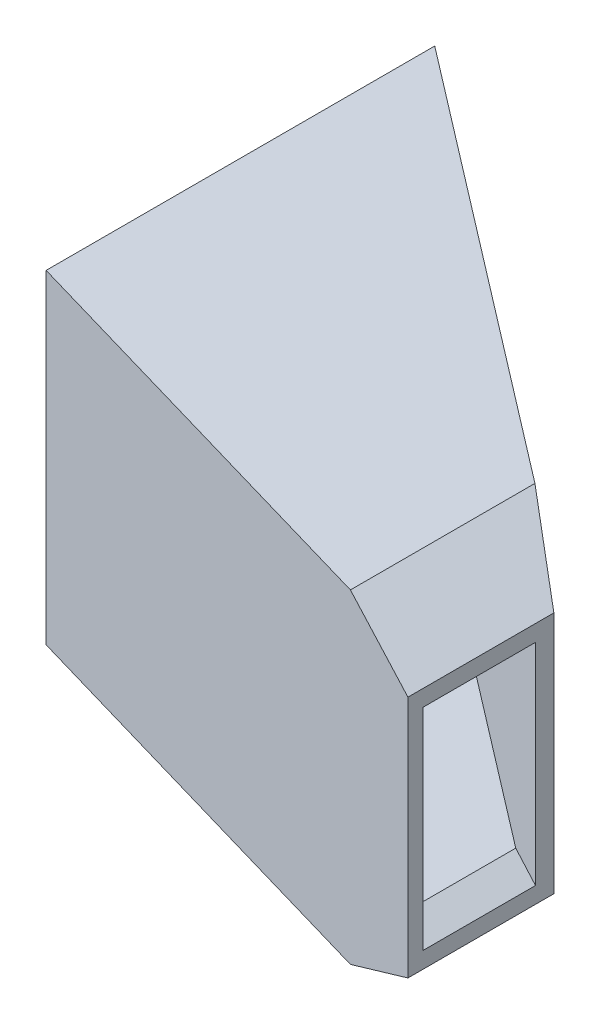
ISO-10303-21;
HEADER;
FILE_DESCRIPTION(('STEP AP214'),'2;1');
FILE_NAME('part.step','',(''),(''),'','','');
FILE_SCHEMA(('AUTOMOTIVE_DESIGN { 1 0 10303 214 1 1 1 1 }'));
ENDSEC;
DATA;
#1=APPLICATION_CONTEXT('core data for automotive mechanical design processes');
#2=APPLICATION_PROTOCOL_DEFINITION('international standard','automotive_design',2000,#1);
#3=PRODUCT_CONTEXT('',#1,'mechanical');
#4=PRODUCT('Part','Part','',(#3));
#5=PRODUCT_RELATED_PRODUCT_CATEGORY('part','',(#4));
#6=PRODUCT_DEFINITION_FORMATION('','',#4);
#7=PRODUCT_DEFINITION_CONTEXT('part definition',#1,'design');
#8=PRODUCT_DEFINITION('design','',#6,#7);
#9=PRODUCT_DEFINITION_SHAPE('','',#8);
#10=(LENGTH_UNIT() NAMED_UNIT(*) SI_UNIT(.MILLI.,.METRE.));
#11=(NAMED_UNIT(*) PLANE_ANGLE_UNIT() SI_UNIT($,.RADIAN.));
#12=(NAMED_UNIT(*) SI_UNIT($,.STERADIAN.) SOLID_ANGLE_UNIT());
#13=UNCERTAINTY_MEASURE_WITH_UNIT(LENGTH_MEASURE(1.E-05),#10,'distance_accuracy_value','');
#14=(GEOMETRIC_REPRESENTATION_CONTEXT(3) GLOBAL_UNCERTAINTY_ASSIGNED_CONTEXT((#13)) GLOBAL_UNIT_ASSIGNED_CONTEXT((#10,
#11,#12)) REPRESENTATION_CONTEXT('',''));
#15=CARTESIAN_POINT('',(0.,0.,0.));
#16=DIRECTION('',(0.,0.,1.));
#17=DIRECTION('',(1.,0.,0.));
#18=AXIS2_PLACEMENT_3D('',#15,#16,#17);
#19=CARTESIAN_POINT('',(76.3273884823616,40.,6.3739099488704));
#20=DIRECTION('',(-1.,0.,0.));
#21=DIRECTION('',(0.,0.,1.));
#22=AXIS2_PLACEMENT_3D('',#19,#20,#21);
#23=PLANE('',#22);
#24=DIRECTION('',(0.,-1.,0.));
#25=VECTOR('',#24,1.);
#26=CARTESIAN_POINT('',(76.3273884823616,40.,24.3739099488704));
#27=LINE('',#26,#25);
#28=CARTESIAN_POINT('',(76.3273884823616,35.,24.3739099488704));
#29=VERTEX_POINT('',#28);
#30=CARTESIAN_POINT('',(76.3273884823616,5.00000000000001,24.3739099488704));
#31=VERTEX_POINT('',#30);
#32=EDGE_CURVE('E231',#29,#31,#27,.T.);
#33=ORIENTED_EDGE('',*,*,#32,.T.);
#34=DIRECTION('',(0.,0.,-1.));
#35=VECTOR('',#34,1.);
#36=CARTESIAN_POINT('',(76.3273884823616,5.00000000000001,6.3739099488704));
#37=LINE('',#36,#35);
#38=CARTESIAN_POINT('',(76.3273884823616,5.00000000000001,6.3739099488704));
#39=VERTEX_POINT('',#38);
#40=EDGE_CURVE('E248',#31,#39,#37,.T.);
#41=ORIENTED_EDGE('',*,*,#40,.T.);
#42=DIRECTION('',(0.,-1.,0.));
#43=VECTOR('',#42,1.);
#44=CARTESIAN_POINT('',(76.3273884823616,40.,6.3739099488704));
#45=LINE('',#44,#43);
#46=CARTESIAN_POINT('',(76.3273884823616,35.,6.3739099488704));
#47=VERTEX_POINT('',#46);
#48=EDGE_CURVE('E227',#47,#39,#45,.T.);
#49=ORIENTED_EDGE('',*,*,#48,.F.);
#50=DIRECTION('',(0.,0.,1.));
#51=VECTOR('',#50,1.);
#52=CARTESIAN_POINT('',(76.3273884823616,35.,6.3739099488704));
#53=LINE('',#52,#51);
#54=EDGE_CURVE('E242',#47,#29,#53,.T.);
#55=ORIENTED_EDGE('',*,*,#54,.T.);
#56=EDGE_LOOP('',(#33,#41,#49,#55));
#57=FACE_BOUND('',#56,.T.);
#58=DIRECTION('',(0.,-1.,0.));
#59=VECTOR('',#58,1.);
#60=CARTESIAN_POINT('',(76.3273884823616,40.,22.4994833782832));
#61=LINE('',#60,#59);
#62=CARTESIAN_POINT('',(76.3273884823616,32.9875388202502,22.4994833782832));
#63=VERTEX_POINT('',#62);
#64=CARTESIAN_POINT('',(76.3273884823616,7.01246117974982,22.4994833782832));
#65=VERTEX_POINT('',#64);
#66=EDGE_CURVE('E162',#63,#65,#61,.T.);
#67=ORIENTED_EDGE('',*,*,#66,.F.);
#68=DIRECTION('',(0.,0.,-1.));
#69=VECTOR('',#68,1.);
#70=CARTESIAN_POINT('',(76.3273884823616,32.9875388202502,0.));
#71=LINE('',#70,#69);
#72=CARTESIAN_POINT('',(76.3273884823616,32.9875388202502,8.64170910102125));
#73=VERTEX_POINT('',#72);
#74=EDGE_CURVE('E143',#73,#63,#71,.F.);
#75=ORIENTED_EDGE('',*,*,#74,.F.);
#76=DIRECTION('',(0.,-1.,0.));
#77=VECTOR('',#76,1.);
#78=CARTESIAN_POINT('',(76.3273884823616,40.,8.64170910102125));
#79=LINE('',#78,#77);
#80=CARTESIAN_POINT('',(76.3273884823616,7.01246117974982,8.64170910102125));
#81=VERTEX_POINT('',#80);
#82=EDGE_CURVE('E62',#73,#81,#79,.T.);
#83=ORIENTED_EDGE('',*,*,#82,.T.);
#84=DIRECTION('',(0.,0.,-1.));
#85=VECTOR('',#84,1.);
#86=CARTESIAN_POINT('',(76.3273884823616,7.01246117974982,6.3739099488704));
#87=LINE('',#86,#85);
#88=EDGE_CURVE('E148',#65,#81,#87,.T.);
#89=ORIENTED_EDGE('',*,*,#88,.F.);
#90=EDGE_LOOP('',(#67,#75,#83,#89));
#91=FACE_BOUND('',#90,.T.);
#92=ADVANCED_FACE('F45',(#57,#91),#23,.F.);
#93=CARTESIAN_POINT('',(13.4281520705218,40.,6.09999250330111));
#94=DIRECTION('',(1.,0.,0.));
#95=DIRECTION('',(0.,0.,-1.));
#96=AXIS2_PLACEMENT_3D('',#93,#94,#95);
#97=PLANE('',#96);
#98=DIRECTION('',(0.,0.,1.));
#99=VECTOR('',#98,1.);
#100=CARTESIAN_POINT('',(13.4281520705218,0.,6.09999250330111));
#101=LINE('',#100,#99);
#102=CARTESIAN_POINT('',(13.4281520705218,0.,-41.8300074966989));
#103=VERTEX_POINT('',#102);
#104=CARTESIAN_POINT('',(13.4281520705218,0.,6.09999250330111));
#105=VERTEX_POINT('',#104);
#106=EDGE_CURVE('E204',#103,#105,#101,.T.);
#107=ORIENTED_EDGE('',*,*,#106,.T.);
#108=DIRECTION('',(0.,-1.,0.));
#109=VECTOR('',#108,1.);
#110=CARTESIAN_POINT('',(13.4281520705218,40.,6.09999250330111));
#111=LINE('',#110,#109);
#112=CARTESIAN_POINT('',(13.4281520705218,40.,6.09999250330111));
#113=VERTEX_POINT('',#112);
#114=EDGE_CURVE('E210',#113,#105,#111,.T.);
#115=ORIENTED_EDGE('',*,*,#114,.F.);
#116=DIRECTION('',(0.,0.,1.));
#117=VECTOR('',#116,1.);
#118=CARTESIAN_POINT('',(13.4281520705218,40.,6.09999250330111));
#119=LINE('',#118,#117);
#120=CARTESIAN_POINT('',(13.4281520705218,40.,-41.8300074966989));
#121=VERTEX_POINT('',#120);
#122=EDGE_CURVE('E207',#121,#113,#119,.T.);
#123=ORIENTED_EDGE('',*,*,#122,.F.);
#124=DIRECTION('',(0.,-1.,0.));
#125=VECTOR('',#124,1.);
#126=CARTESIAN_POINT('',(13.4281520705218,40.,-41.8300074966989));
#127=LINE('',#126,#125);
#128=EDGE_CURVE('E223',#121,#103,#127,.T.);
#129=ORIENTED_EDGE('',*,*,#128,.T.);
#130=EDGE_LOOP('',(#107,#115,#123,#129));
#131=FACE_BOUND('',#130,.T.);
#132=DIRECTION('',(0.,0.,1.));
#133=VECTOR('',#132,1.);
#134=CARTESIAN_POINT('',(13.4281520705218,1.8,0.));
#135=LINE('',#134,#133);
#136=CARTESIAN_POINT('',(13.4281520705218,1.8,-39.562208344548));
#137=VERTEX_POINT('',#136);
#138=CARTESIAN_POINT('',(13.4281520705218,1.8,4.22556593271388));
#139=VERTEX_POINT('',#138);
#140=EDGE_CURVE('E157',#137,#139,#135,.T.);
#141=ORIENTED_EDGE('',*,*,#140,.F.);
#142=DIRECTION('',(0.,-1.,0.));
#143=VECTOR('',#142,1.);
#144=CARTESIAN_POINT('',(13.4281520705218,40.,-39.562208344548));
#145=LINE('',#144,#143);
#146=CARTESIAN_POINT('',(13.4281520705218,38.2,-39.562208344548));
#147=VERTEX_POINT('',#146);
#148=EDGE_CURVE('E187',#147,#137,#145,.T.);
#149=ORIENTED_EDGE('',*,*,#148,.F.);
#150=DIRECTION('',(0.,0.,1.));
#151=VECTOR('',#150,1.);
#152=CARTESIAN_POINT('',(13.4281520705218,38.2,0.));
#153=LINE('',#152,#151);
#154=CARTESIAN_POINT('',(13.4281520705218,38.2,4.22556593271388));
#155=VERTEX_POINT('',#154);
#156=EDGE_CURVE('E70',#147,#155,#153,.T.);
#157=ORIENTED_EDGE('',*,*,#156,.T.);
#158=DIRECTION('',(0.,-1.,0.));
#159=VECTOR('',#158,1.);
#160=CARTESIAN_POINT('',(13.4281520705218,40.,4.22556593271388));
#161=LINE('',#160,#159);
#162=EDGE_CURVE('E154',#155,#139,#161,.T.);
#163=ORIENTED_EDGE('',*,*,#162,.T.);
#164=EDGE_LOOP('',(#141,#149,#157,#163));
#165=FACE_BOUND('',#164,.T.);
#166=ADVANCED_FACE('F285',(#131,#165),#97,.F.);
#167=CARTESIAN_POINT('',(76.3273884823616,40.,24.3739099488704));
#168=DIRECTION('',(0.278991106039226,0.,-0.960293685676944));
#169=DIRECTION('',(-0.960293685676944,0.,-0.278991106039226));
#170=AXIS2_PLACEMENT_3D('',#167,#168,#169);
#171=PLANE('',#170);
#172=DIRECTION('',(0.960293685676944,0.,0.278991106039226));
#173=VECTOR('',#172,1.);
#174=CARTESIAN_POINT('',(76.3273884823616,0.,24.3739099488704));
#175=LINE('',#174,#173);
#176=CARTESIAN_POINT('',(66.3273884823616,0.,21.4686413815513));
#177=VERTEX_POINT('',#176);
#178=EDGE_CURVE('E211',#105,#177,#175,.T.);
#179=ORIENTED_EDGE('',*,*,#178,.T.);
#180=DIRECTION('',(0.865677302317111,0.432838651158554,0.251502505586352));
#181=VECTOR('',#180,1.);
#182=CARTESIAN_POINT('',(72.4084282922459,3.04051990494213,23.2353467631786));
#183=LINE('',#182,#181);
#184=EDGE_CURVE('E11',#177,#31,#183,.T.);
#185=ORIENTED_EDGE('',*,*,#184,.T.);
#186=ORIENTED_EDGE('',*,*,#32,.F.);
#187=DIRECTION('',(0.865677302317111,-0.432838651158553,0.251502505586352));
#188=VECTOR('',#187,1.);
#189=CARTESIAN_POINT('',(61.6532356540187,42.3370764141714,20.1106744524482));
#190=LINE('',#189,#188);
#191=CARTESIAN_POINT('',(66.3273884823616,40.,21.4686413815513));
#192=VERTEX_POINT('',#191);
#193=EDGE_CURVE('E245',#29,#192,#190,.F.);
#194=ORIENTED_EDGE('',*,*,#193,.T.);
#195=DIRECTION('',(0.960293685676944,0.,0.278991106039226));
#196=VECTOR('',#195,1.);
#197=CARTESIAN_POINT('',(76.3273884823616,40.,24.3739099488704));
#198=LINE('',#197,#196);
#199=EDGE_CURVE('E199',#113,#192,#198,.T.);
#200=ORIENTED_EDGE('',*,*,#199,.F.);
#201=ORIENTED_EDGE('',*,*,#114,.T.);
#202=EDGE_LOOP('',(#179,#185,#186,#194,#200,#201));
#203=FACE_BOUND('',#202,.T.);
#204=ADVANCED_FACE('F264',(#203),#171,.F.);
#205=CARTESIAN_POINT('',(13.4281520705218,40.,-41.8300074966989));
#206=DIRECTION('',(-0.608281876888897,0.,0.793721083409355));
#207=DIRECTION('',(0.793721083409355,0.,0.608281876888897));
#208=AXIS2_PLACEMENT_3D('',#205,#206,#207);
#209=PLANE('',#208);
#210=ORIENTED_EDGE('',*,*,#48,.T.);
#211=DIRECTION('',(-0.737747484816308,-0.368873742408152,-0.565385541740338));
#212=VECTOR('',#211,1.);
#213=CARTESIAN_POINT('',(76.3273884823616,5.00000000000001,6.37390994887039));
#214=LINE('',#213,#212);
#215=CARTESIAN_POINT('',(66.3273884823616,0.,-1.28976296600397));
#216=VERTEX_POINT('',#215);
#217=EDGE_CURVE('E252',#39,#216,#214,.T.);
#218=ORIENTED_EDGE('',*,*,#217,.T.);
#219=DIRECTION('',(-0.793721083409355,0.,-0.608281876888897));
#220=VECTOR('',#219,1.);
#221=CARTESIAN_POINT('',(13.4281520705218,0.,-41.8300074966989));
#222=LINE('',#221,#220);
#223=EDGE_CURVE('E215',#216,#103,#222,.T.);
#224=ORIENTED_EDGE('',*,*,#223,.T.);
#225=ORIENTED_EDGE('',*,*,#128,.F.);
#226=DIRECTION('',(-0.793721083409355,0.,-0.608281876888897));
#227=VECTOR('',#226,1.);
#228=CARTESIAN_POINT('',(13.4281520705218,40.,-41.8300074966989));
#229=LINE('',#228,#227);
#230=CARTESIAN_POINT('',(66.3273884823616,40.,-1.28976296600397));
#231=VERTEX_POINT('',#230);
#232=EDGE_CURVE('E203',#231,#121,#229,.T.);
#233=ORIENTED_EDGE('',*,*,#232,.F.);
#234=DIRECTION('',(-0.737747484816308,0.368873742408152,-0.565385541740338));
#235=VECTOR('',#234,1.);
#236=CARTESIAN_POINT('',(66.8653637848618,39.7310123487499,-0.877476290539695));
#237=LINE('',#236,#235);
#238=EDGE_CURVE('E239',#231,#47,#237,.F.);
#239=ORIENTED_EDGE('',*,*,#238,.T.);
#240=EDGE_LOOP('',(#210,#218,#224,#225,#233,#239));
#241=FACE_BOUND('',#240,.T.);
#242=ADVANCED_FACE('F274',(#241),#209,.F.);
#243=CARTESIAN_POINT('',(0.,40.,0.));
#244=DIRECTION('',(0.,-1.,0.));
#245=DIRECTION('',(0.,0.,-1.));
#246=AXIS2_PLACEMENT_3D('',#243,#244,#245);
#247=PLANE('',#246);
#248=ORIENTED_EDGE('',*,*,#199,.T.);
#249=DIRECTION('',(0.,0.,-1.));
#250=VECTOR('',#249,1.);
#251=CARTESIAN_POINT('',(66.3273884823616,40.,0.));
#252=LINE('',#251,#250);
#253=EDGE_CURVE('E235',#192,#231,#252,.T.);
#254=ORIENTED_EDGE('',*,*,#253,.T.);
#255=ORIENTED_EDGE('',*,*,#232,.T.);
#256=ORIENTED_EDGE('',*,*,#122,.T.);
#257=EDGE_LOOP('',(#248,#254,#255,#256));
#258=FACE_BOUND('',#257,.T.);
#259=ADVANCED_FACE('F282',(#258),#247,.F.);
#260=CARTESIAN_POINT('',(0.,0.,0.));
#261=DIRECTION('',(0.,-1.,0.));
#262=DIRECTION('',(0.,0.,-1.));
#263=AXIS2_PLACEMENT_3D('',#260,#261,#262);
#264=PLANE('',#263);
#265=ORIENTED_EDGE('',*,*,#223,.F.);
#266=DIRECTION('',(0.,0.,1.));
#267=VECTOR('',#266,1.);
#268=CARTESIAN_POINT('',(66.3273884823616,0.,24.3739099488704));
#269=LINE('',#268,#267);
#270=EDGE_CURVE('E55',#216,#177,#269,.T.);
#271=ORIENTED_EDGE('',*,*,#270,.T.);
#272=ORIENTED_EDGE('',*,*,#178,.F.);
#273=ORIENTED_EDGE('',*,*,#106,.F.);
#274=EDGE_LOOP('',(#265,#271,#272,#273));
#275=FACE_BOUND('',#274,.T.);
#276=ADVANCED_FACE('F259',(#275),#264,.T.);
#277=CARTESIAN_POINT('',(66.3273884823616,40.,0.));
#278=DIRECTION('',(-0.447213595499956,-0.894427190999917,0.));
#279=DIRECTION('',(0.,0.,-1.));
#280=AXIS2_PLACEMENT_3D('',#277,#278,#279);
#281=PLANE('',#280);
#282=ORIENTED_EDGE('',*,*,#193,.F.);
#283=ORIENTED_EDGE('',*,*,#54,.F.);
#284=ORIENTED_EDGE('',*,*,#238,.F.);
#285=ORIENTED_EDGE('',*,*,#253,.F.);
#286=EDGE_LOOP('',(#282,#283,#284,#285));
#287=FACE_BOUND('',#286,.T.);
#288=ADVANCED_FACE('F280',(#287),#281,.F.);
#289=CARTESIAN_POINT('',(76.3273884823616,5.00000000000001,6.3739099488704));
#290=DIRECTION('',(0.447213595499956,-0.894427190999917,0.));
#291=DIRECTION('',(0.,0.,1.));
#292=AXIS2_PLACEMENT_3D('',#289,#290,#291);
#293=PLANE('',#292);
#294=ORIENTED_EDGE('',*,*,#184,.F.);
#295=ORIENTED_EDGE('',*,*,#270,.F.);
#296=ORIENTED_EDGE('',*,*,#217,.F.);
#297=ORIENTED_EDGE('',*,*,#40,.F.);
#298=EDGE_LOOP('',(#294,#295,#296,#297));
#299=FACE_BOUND('',#298,.T.);
#300=ADVANCED_FACE('F48',(#299),#293,.T.);
#301=CARTESIAN_POINT('',(76.8295724732322,40.,22.6453813146519));
#302=DIRECTION('',(0.278991106039226,0.,-0.960293685676944));
#303=DIRECTION('',(-0.960293685676944,0.,-0.278991106039226));
#304=AXIS2_PLACEMENT_3D('',#301,#302,#303);
#305=PLANE('',#304);
#306=DIRECTION('',(0.960293685676944,0.,0.278991106039226));
#307=VECTOR('',#306,1.);
#308=CARTESIAN_POINT('',(-0.0868915806029992,1.8,0.299082782158));
#309=LINE('',#308,#307);
#310=CARTESIAN_POINT('',(65.902466122862,1.8,19.4707634535035));
#311=VERTEX_POINT('',#310);
#312=EDGE_CURVE('E177',#139,#311,#309,.T.);
#313=ORIENTED_EDGE('',*,*,#312,.F.);
#314=ORIENTED_EDGE('',*,*,#162,.F.);
#315=DIRECTION('',(0.960293685676944,0.,0.278991106039226));
#316=VECTOR('',#315,1.);
#317=CARTESIAN_POINT('',(-0.0868915806029992,38.2,0.299082782158));
#318=LINE('',#317,#316);
#319=CARTESIAN_POINT('',(65.902466122862,38.2,19.4707634535035));
#320=VERTEX_POINT('',#319);
#321=EDGE_CURVE('E150',#155,#320,#318,.T.);
#322=ORIENTED_EDGE('',*,*,#321,.T.);
#323=DIRECTION('',(0.865677302317111,-0.432838651158553,0.251502505586352));
#324=VECTOR('',#323,1.);
#325=CARTESIAN_POINT('',(61.3072694484624,40.4975983371998,18.1357354076253));
#326=LINE('',#325,#324);
#327=EDGE_CURVE('E137',#63,#320,#326,.F.);
#328=ORIENTED_EDGE('',*,*,#327,.F.);
#329=ORIENTED_EDGE('',*,*,#66,.T.);
#330=DIRECTION('',(0.865677302317111,0.432838651158554,0.251502505586352));
#331=VECTOR('',#330,1.);
#332=CARTESIAN_POINT('',(72.0624620866896,4.8799979819138,21.2604077183556));
#333=LINE('',#332,#331);
#334=EDGE_CURVE('E180',#311,#65,#333,.T.);
#335=ORIENTED_EDGE('',*,*,#334,.F.);
#336=EDGE_LOOP('',(#313,#314,#322,#328,#329,#335));
#337=FACE_BOUND('',#336,.T.);
#338=ADVANCED_FACE('F152',(#337),#305,.T.);
#339=CARTESIAN_POINT('',(12.3332446921218,40.,-40.4013095465621));
#340=DIRECTION('',(-0.608281876888897,0.,0.793721083409355));
#341=DIRECTION('',(0.793721083409355,0.,0.608281876888897));
#342=AXIS2_PLACEMENT_3D('',#339,#340,#341);
#343=PLANE('',#342);
#344=ORIENTED_EDGE('',*,*,#82,.F.);
#345=DIRECTION('',(-0.737747484816308,0.368873742408152,-0.565385541740338));
#346=VECTOR('',#345,1.);
#347=CARTESIAN_POINT('',(65.3717756031501,38.4653452598559,0.245685732195083));
#348=LINE('',#347,#346);
#349=CARTESIAN_POINT('',(65.902466122862,38.2,0.652389588404729));
#350=VERTEX_POINT('',#349);
#351=EDGE_CURVE('E161',#350,#73,#348,.F.);
#352=ORIENTED_EDGE('',*,*,#351,.F.);
#353=DIRECTION('',(-0.793721083409355,0.,-0.608281876888897));
#354=VECTOR('',#353,1.);
#355=CARTESIAN_POINT('',(24.0693856480528,38.2,-31.4071149896505));
#356=LINE('',#355,#354);
#357=EDGE_CURVE('E156',#350,#147,#356,.T.);
#358=ORIENTED_EDGE('',*,*,#357,.T.);
#359=ORIENTED_EDGE('',*,*,#148,.T.);
#360=DIRECTION('',(-0.793721083409355,0.,-0.608281876888897));
#361=VECTOR('',#360,1.);
#362=CARTESIAN_POINT('',(24.0693856480528,1.8,-31.4071149896505));
#363=LINE('',#362,#361);
#364=CARTESIAN_POINT('',(65.902466122862,1.8,0.652389588404715));
#365=VERTEX_POINT('',#364);
#366=EDGE_CURVE('E175',#365,#137,#363,.T.);
#367=ORIENTED_EDGE('',*,*,#366,.F.);
#368=DIRECTION('',(-0.737747484816308,-0.368873742408152,-0.565385541740338));
#369=VECTOR('',#368,1.);
#370=CARTESIAN_POINT('',(74.8338003006499,6.26566708889394,7.49707197160518));
#371=LINE('',#370,#369);
#372=EDGE_CURVE('E171',#81,#365,#371,.T.);
#373=ORIENTED_EDGE('',*,*,#372,.F.);
#374=EDGE_LOOP('',(#344,#352,#358,#359,#367,#373));
#375=FACE_BOUND('',#374,.T.);
#376=ADVANCED_FACE('F333',(#375),#343,.T.);
#377=CARTESIAN_POINT('',(0.,38.2,0.));
#378=DIRECTION('',(0.,-1.,0.));
#379=DIRECTION('',(0.,0.,-1.));
#380=AXIS2_PLACEMENT_3D('',#377,#378,#379);
#381=PLANE('',#380);
#382=ORIENTED_EDGE('',*,*,#321,.F.);
#383=ORIENTED_EDGE('',*,*,#156,.F.);
#384=ORIENTED_EDGE('',*,*,#357,.F.);
#385=DIRECTION('',(0.,0.,1.));
#386=VECTOR('',#385,1.);
#387=CARTESIAN_POINT('',(65.902466122862,38.2,0.));
#388=LINE('',#387,#386);
#389=EDGE_CURVE('E141',#320,#350,#388,.F.);
#390=ORIENTED_EDGE('',*,*,#389,.F.);
#391=EDGE_LOOP('',(#382,#383,#384,#390));
#392=FACE_BOUND('',#391,.T.);
#393=ADVANCED_FACE('F159',(#392),#381,.T.);
#394=CARTESIAN_POINT('',(0.,1.8,0.));
#395=DIRECTION('',(0.,-1.,0.));
#396=DIRECTION('',(0.,0.,-1.));
#397=AXIS2_PLACEMENT_3D('',#394,#395,#396);
#398=PLANE('',#397);
#399=ORIENTED_EDGE('',*,*,#366,.T.);
#400=ORIENTED_EDGE('',*,*,#140,.T.);
#401=ORIENTED_EDGE('',*,*,#312,.T.);
#402=DIRECTION('',(0.,0.,1.));
#403=VECTOR('',#402,1.);
#404=CARTESIAN_POINT('',(65.902466122862,1.8,0.));
#405=LINE('',#404,#403);
#406=EDGE_CURVE('E174',#365,#311,#405,.T.);
#407=ORIENTED_EDGE('',*,*,#406,.F.);
#408=EDGE_LOOP('',(#399,#400,#401,#407));
#409=FACE_BOUND('',#408,.T.);
#410=ADVANCED_FACE('F293',(#409),#398,.F.);
#411=CARTESIAN_POINT('',(65.5224040104617,38.3900310562002,0.));
#412=DIRECTION('',(-0.447213595499956,-0.894427190999917,0.));
#413=DIRECTION('',(0.,0.,-1.));
#414=AXIS2_PLACEMENT_3D('',#411,#412,#413);
#415=PLANE('',#414);
#416=ORIENTED_EDGE('',*,*,#327,.T.);
#417=ORIENTED_EDGE('',*,*,#389,.T.);
#418=ORIENTED_EDGE('',*,*,#351,.T.);
#419=ORIENTED_EDGE('',*,*,#74,.T.);
#420=EDGE_LOOP('',(#416,#417,#418,#419));
#421=FACE_BOUND('',#420,.T.);
#422=ADVANCED_FACE('F139',(#421),#415,.T.);
#423=CARTESIAN_POINT('',(75.5224040104617,6.60996894379986,6.3739099488704));
#424=DIRECTION('',(0.447213595499956,-0.894427190999917,0.));
#425=DIRECTION('',(0.,0.,1.));
#426=AXIS2_PLACEMENT_3D('',#423,#424,#425);
#427=PLANE('',#426);
#428=ORIENTED_EDGE('',*,*,#334,.T.);
#429=ORIENTED_EDGE('',*,*,#88,.T.);
#430=ORIENTED_EDGE('',*,*,#372,.T.);
#431=ORIENTED_EDGE('',*,*,#406,.T.);
#432=EDGE_LOOP('',(#428,#429,#430,#431));
#433=FACE_BOUND('',#432,.T.);
#434=ADVANCED_FACE('F302',(#433),#427,.F.);
#435=CLOSED_SHELL('',(#92,#166,#204,#242,#259,#276,#288,#300,#338,#376,#393,#410,#422,#434));
#436=MANIFOLD_SOLID_BREP('B2',#435);
#437=ADVANCED_BREP_SHAPE_REPRESENTATION('',(#18,#436),#14);
#438=SHAPE_DEFINITION_REPRESENTATION(#9,#437);
ENDSEC;
END-ISO-10303-21;
